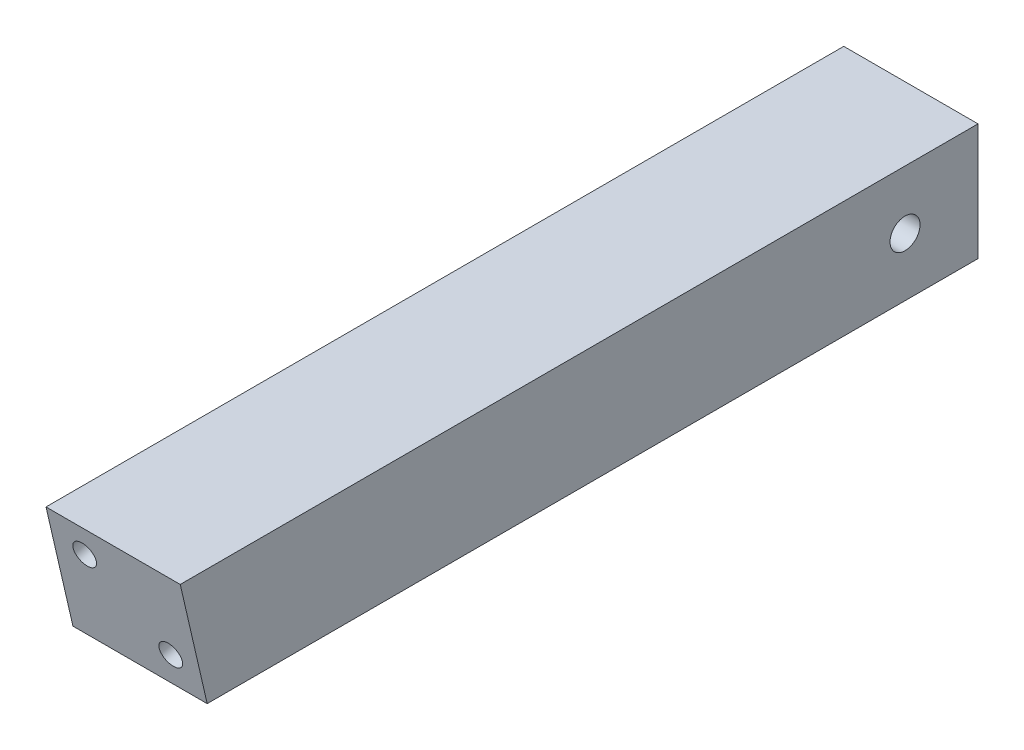
ISO-10303-21;
HEADER;
FILE_DESCRIPTION(('STEP AP214'),'2;1');
FILE_NAME('part.step','',(''),(''),'','','');
FILE_SCHEMA(('AUTOMOTIVE_DESIGN { 1 0 10303 214 1 1 1 1 }'));
ENDSEC;
DATA;
#1=APPLICATION_CONTEXT('core data for automotive mechanical design processes');
#2=APPLICATION_PROTOCOL_DEFINITION('international standard','automotive_design',2000,#1);
#3=PRODUCT_CONTEXT('',#1,'mechanical');
#4=PRODUCT('Part','Part','',(#3));
#5=PRODUCT_RELATED_PRODUCT_CATEGORY('part','',(#4));
#6=PRODUCT_DEFINITION_FORMATION('','',#4);
#7=PRODUCT_DEFINITION_CONTEXT('part definition',#1,'design');
#8=PRODUCT_DEFINITION('design','',#6,#7);
#9=PRODUCT_DEFINITION_SHAPE('','',#8);
#10=(LENGTH_UNIT() NAMED_UNIT(*) SI_UNIT(.MILLI.,.METRE.));
#11=(NAMED_UNIT(*) PLANE_ANGLE_UNIT() SI_UNIT($,.RADIAN.));
#12=(NAMED_UNIT(*) SI_UNIT($,.STERADIAN.) SOLID_ANGLE_UNIT());
#13=UNCERTAINTY_MEASURE_WITH_UNIT(LENGTH_MEASURE(1.E-05),#10,'distance_accuracy_value','');
#14=(GEOMETRIC_REPRESENTATION_CONTEXT(3) GLOBAL_UNCERTAINTY_ASSIGNED_CONTEXT((#13)) GLOBAL_UNIT_ASSIGNED_CONTEXT((#10,
#11,#12)) REPRESENTATION_CONTEXT('',''));
#15=CARTESIAN_POINT('',(0.,0.,0.));
#16=DIRECTION('',(0.,0.,1.));
#17=DIRECTION('',(1.,0.,0.));
#18=AXIS2_PLACEMENT_3D('',#15,#16,#17);
#19=CARTESIAN_POINT('',(267.669465585855,1012.34188712072,388.497872948252));
#20=DIRECTION('',(0.,-0.224951054343865,0.974370064785235));
#21=DIRECTION('',(0.,0.974370064785235,0.224951054343865));
#22=AXIS2_PLACEMENT_3D('',#19,#20,#21);
#23=PLANE('',#22);
#24=CARTESIAN_POINT('',(-7.62000000000001,6.51275008861376,156.283919500264));
#25=DIRECTION('',(0.,0.224951054343865,-0.974370064785235));
#26=DIRECTION('',(0.,0.974370064785235,0.224951054343865));
#27=AXIS2_PLACEMENT_3D('',#24,#25,#26);
#28=CIRCLE('',#27,2.52729999999989);
#29=CARTESIAN_POINT('',(-7.62000000000001,8.97527555334538,156.852438299907));
#30=VERTEX_POINT('',#29);
#31=EDGE_CURVE('E132',#30,#30,#28,.T.);
#32=ORIENTED_EDGE('',*,*,#31,.T.);
#33=EDGE_LOOP('',(#32));
#34=FACE_BOUND('',#33,.T.);
#35=CARTESIAN_POINT('',(8.25499999999999,-5.86174973415873,153.427041110097));
#36=DIRECTION('',(0.,0.224951054343865,-0.974370064785235));
#37=DIRECTION('',(0.,0.974370064785235,0.224951054343865));
#38=AXIS2_PLACEMENT_3D('',#35,#36,#37);
#39=CIRCLE('',#38,2.52729999999989);
#40=CARTESIAN_POINT('',(8.25499999999999,-3.39922426942711,153.99555990974));
#41=VERTEX_POINT('',#40);
#42=EDGE_CURVE('E135',#41,#41,#39,.T.);
#43=ORIENTED_EDGE('',*,*,#42,.T.);
#44=EDGE_LOOP('',(#43));
#45=FACE_BOUND('',#44,.T.);
#46=DIRECTION('',(0.,-0.974370064785235,-0.224951054343865));
#47=VECTOR('',#46,1.);
#48=CARTESIAN_POINT('',(-14.605,20.653377152135,159.5485404918));
#49=LINE('',#48,#47);
#50=CARTESIAN_POINT('',(-14.605,12.7,157.712358695347));
#51=VERTEX_POINT('',#50);
#52=CARTESIAN_POINT('',(-14.605,-12.7,151.848306640758));
#53=VERTEX_POINT('',#52);
#54=EDGE_CURVE('E46',#51,#53,#49,.T.);
#55=ORIENTED_EDGE('',*,*,#54,.T.);
#56=DIRECTION('',(1.,0.,0.));
#57=VECTOR('',#56,1.);
#58=CARTESIAN_POINT('',(14.605,-12.7,151.848306640758));
#59=LINE('',#58,#57);
#60=CARTESIAN_POINT('',(14.605,-12.7,151.848306640758));
#61=VERTEX_POINT('',#60);
#62=EDGE_CURVE('E97',#53,#61,#59,.T.);
#63=ORIENTED_EDGE('',*,*,#62,.T.);
#64=DIRECTION('',(0.,0.974370064785235,0.224951054343865));
#65=VECTOR('',#64,1.);
#66=CARTESIAN_POINT('',(14.605,20.653377152135,159.5485404918));
#67=LINE('',#66,#65);
#68=CARTESIAN_POINT('',(14.605,12.7,157.712358695347));
#69=VERTEX_POINT('',#68);
#70=EDGE_CURVE('E109',#61,#69,#67,.T.);
#71=ORIENTED_EDGE('',*,*,#70,.T.);
#72=DIRECTION('',(-1.,0.,0.));
#73=VECTOR('',#72,1.);
#74=CARTESIAN_POINT('',(14.605,12.7,157.712358695347));
#75=LINE('',#74,#73);
#76=EDGE_CURVE('E102',#69,#51,#75,.T.);
#77=ORIENTED_EDGE('',*,*,#76,.T.);
#78=EDGE_LOOP('',(#55,#63,#71,#77));
#79=FACE_BOUND('',#78,.T.);
#80=ADVANCED_FACE('F39',(#34,#45,#79),#23,.T.);
#81=CARTESIAN_POINT('',(14.605,-12.7,193.998401745355));
#82=DIRECTION('',(0.,-1.,0.));
#83=DIRECTION('',(1.,0.,0.));
#84=AXIS2_PLACEMENT_3D('',#81,#82,#83);
#85=PLANE('',#84);
#86=DIRECTION('',(0.,0.,-1.));
#87=VECTOR('',#86,1.);
#88=CARTESIAN_POINT('',(-14.605,-12.7,193.998401745355));
#89=LINE('',#88,#87);
#90=CARTESIAN_POINT('',(-14.605,-12.7,-15.875));
#91=VERTEX_POINT('',#90);
#92=EDGE_CURVE('E11',#53,#91,#89,.T.);
#93=ORIENTED_EDGE('',*,*,#92,.T.);
#94=DIRECTION('',(1.,0.,0.));
#95=VECTOR('',#94,1.);
#96=CARTESIAN_POINT('',(14.605,-12.7,-15.875));
#97=LINE('',#96,#95);
#98=CARTESIAN_POINT('',(14.605,-12.7,-15.875));
#99=VERTEX_POINT('',#98);
#100=EDGE_CURVE('E88',#91,#99,#97,.T.);
#101=ORIENTED_EDGE('',*,*,#100,.T.);
#102=DIRECTION('',(0.,0.,-1.));
#103=VECTOR('',#102,1.);
#104=CARTESIAN_POINT('',(14.605,-12.7,193.998401745355));
#105=LINE('',#104,#103);
#106=EDGE_CURVE('E59',#61,#99,#105,.T.);
#107=ORIENTED_EDGE('',*,*,#106,.F.);
#108=ORIENTED_EDGE('',*,*,#62,.F.);
#109=EDGE_LOOP('',(#93,#101,#107,#108));
#110=FACE_BOUND('',#109,.T.);
#111=ADVANCED_FACE('F95',(#110),#85,.T.);
#112=CARTESIAN_POINT('',(14.605,12.7,193.998401745355));
#113=DIRECTION('',(1.,0.,0.));
#114=DIRECTION('',(0.,1.,0.));
#115=AXIS2_PLACEMENT_3D('',#112,#113,#114);
#116=PLANE('',#115);
#117=CARTESIAN_POINT('',(14.605,0.,0.));
#118=DIRECTION('',(1.,0.,0.));
#119=DIRECTION('',(0.,-1.,0.));
#120=AXIS2_PLACEMENT_3D('',#117,#118,#119);
#121=CIRCLE('',#120,3.2639);
#122=CARTESIAN_POINT('',(14.605,-3.2639,0.));
#123=VERTEX_POINT('',#122);
#124=EDGE_CURVE('E141',#123,#123,#121,.T.);
#125=ORIENTED_EDGE('',*,*,#124,.F.);
#126=EDGE_LOOP('',(#125));
#127=FACE_BOUND('',#126,.T.);
#128=ORIENTED_EDGE('',*,*,#106,.T.);
#129=DIRECTION('',(0.,1.,0.));
#130=VECTOR('',#129,1.);
#131=CARTESIAN_POINT('',(14.605,12.7,-15.875));
#132=LINE('',#131,#130);
#133=CARTESIAN_POINT('',(14.605,12.7,-15.875));
#134=VERTEX_POINT('',#133);
#135=EDGE_CURVE('E93',#99,#134,#132,.T.);
#136=ORIENTED_EDGE('',*,*,#135,.T.);
#137=DIRECTION('',(0.,0.,-1.));
#138=VECTOR('',#137,1.);
#139=CARTESIAN_POINT('',(14.605,12.7,193.998401745355));
#140=LINE('',#139,#138);
#141=EDGE_CURVE('E108',#69,#134,#140,.T.);
#142=ORIENTED_EDGE('',*,*,#141,.F.);
#143=ORIENTED_EDGE('',*,*,#70,.F.);
#144=EDGE_LOOP('',(#128,#136,#142,#143));
#145=FACE_BOUND('',#144,.T.);
#146=ADVANCED_FACE('F112',(#127,#145),#116,.T.);
#147=CARTESIAN_POINT('',(14.605,12.7,193.998401745355));
#148=DIRECTION('',(0.,1.,0.));
#149=DIRECTION('',(-1.,0.,0.));
#150=AXIS2_PLACEMENT_3D('',#147,#148,#149);
#151=PLANE('',#150);
#152=ORIENTED_EDGE('',*,*,#141,.T.);
#153=DIRECTION('',(-1.,0.,0.));
#154=VECTOR('',#153,1.);
#155=CARTESIAN_POINT('',(14.605,12.7,-15.875));
#156=LINE('',#155,#154);
#157=CARTESIAN_POINT('',(-14.605,12.7,-15.875));
#158=VERTEX_POINT('',#157);
#159=EDGE_CURVE('E82',#134,#158,#156,.T.);
#160=ORIENTED_EDGE('',*,*,#159,.T.);
#161=DIRECTION('',(0.,0.,-1.));
#162=VECTOR('',#161,1.);
#163=CARTESIAN_POINT('',(-14.605,12.7,193.998401745355));
#164=LINE('',#163,#162);
#165=EDGE_CURVE('E72',#51,#158,#164,.T.);
#166=ORIENTED_EDGE('',*,*,#165,.F.);
#167=ORIENTED_EDGE('',*,*,#76,.F.);
#168=EDGE_LOOP('',(#152,#160,#166,#167));
#169=FACE_BOUND('',#168,.T.);
#170=ADVANCED_FACE('F113',(#169),#151,.T.);
#171=CARTESIAN_POINT('',(-14.605,12.7,193.998401745355));
#172=DIRECTION('',(-1.,0.,0.));
#173=DIRECTION('',(0.,-1.,0.));
#174=AXIS2_PLACEMENT_3D('',#171,#172,#173);
#175=PLANE('',#174);
#176=CARTESIAN_POINT('',(-14.605,0.,0.));
#177=DIRECTION('',(1.,0.,0.));
#178=DIRECTION('',(0.,-1.,0.));
#179=AXIS2_PLACEMENT_3D('',#176,#177,#178);
#180=CIRCLE('',#179,3.2639);
#181=CARTESIAN_POINT('',(-14.605,-3.2639,0.));
#182=VERTEX_POINT('',#181);
#183=EDGE_CURVE('E147',#182,#182,#180,.T.);
#184=ORIENTED_EDGE('',*,*,#183,.T.);
#185=EDGE_LOOP('',(#184));
#186=FACE_BOUND('',#185,.T.);
#187=ORIENTED_EDGE('',*,*,#165,.T.);
#188=DIRECTION('',(0.,-1.,0.));
#189=VECTOR('',#188,1.);
#190=CARTESIAN_POINT('',(-14.605,12.7,-15.875));
#191=LINE('',#190,#189);
#192=EDGE_CURVE('E79',#158,#91,#191,.T.);
#193=ORIENTED_EDGE('',*,*,#192,.T.);
#194=ORIENTED_EDGE('',*,*,#92,.F.);
#195=ORIENTED_EDGE('',*,*,#54,.F.);
#196=EDGE_LOOP('',(#187,#193,#194,#195));
#197=FACE_BOUND('',#196,.T.);
#198=ADVANCED_FACE('F87',(#186,#197),#175,.T.);
#199=CARTESIAN_POINT('',(0.,0.,-15.875));
#200=DIRECTION('',(0.,0.,1.));
#201=DIRECTION('',(-1.,0.,0.));
#202=AXIS2_PLACEMENT_3D('',#199,#200,#201);
#203=PLANE('',#202);
#204=ORIENTED_EDGE('',*,*,#192,.F.);
#205=ORIENTED_EDGE('',*,*,#159,.F.);
#206=ORIENTED_EDGE('',*,*,#135,.F.);
#207=ORIENTED_EDGE('',*,*,#100,.F.);
#208=EDGE_LOOP('',(#204,#205,#206,#207));
#209=FACE_BOUND('',#208,.T.);
#210=ADVANCED_FACE('F91',(#209),#203,.F.);
#211=CARTESIAN_POINT('',(8.25499999999999,-2.29065174644987,137.958916331631));
#212=DIRECTION('',(0.,-0.224951054343865,0.974370064785235));
#213=DIRECTION('',(0.,0.974370064785235,0.224951054343865));
#214=AXIS2_PLACEMENT_3D('',#211,#212,#213);
#215=CYLINDRICAL_SURFACE('',#214,2.52729999999989);
#216=CARTESIAN_POINT('',(8.25499999999999,-2.29065174644987,137.958916331631));
#217=DIRECTION('',(0.,0.224951054343865,-0.974370064785235));
#218=DIRECTION('',(0.,0.974370064785235,0.224951054343865));
#219=AXIS2_PLACEMENT_3D('',#216,#217,#218);
#220=CIRCLE('',#219,2.52729999999989);
#221=CARTESIAN_POINT('',(8.25499999999999,0.17187371828175,138.527435131274));
#222=VERTEX_POINT('',#221);
#223=EDGE_CURVE('E137',#222,#222,#220,.T.);
#224=ORIENTED_EDGE('',*,*,#223,.T.);
#225=EDGE_LOOP('',(#224));
#226=FACE_BOUND('',#225,.T.);
#227=ORIENTED_EDGE('',*,*,#42,.F.);
#228=EDGE_LOOP('',(#227));
#229=FACE_BOUND('',#228,.T.);
#230=ADVANCED_FACE('F170',(#226,#229),#215,.F.);
#231=CARTESIAN_POINT('',(8.25499999999999,-2.29065174644987,137.958916331631));
#232=DIRECTION('',(0.,-0.224951054343865,0.974370064785235));
#233=DIRECTION('',(0.,0.974370064785235,0.224951054343865));
#234=AXIS2_PLACEMENT_3D('',#231,#232,#233);
#235=PLANE('',#234);
#236=ORIENTED_EDGE('',*,*,#223,.F.);
#237=EDGE_LOOP('',(#236));
#238=FACE_BOUND('',#237,.T.);
#239=ADVANCED_FACE('F168',(#238),#235,.T.);
#240=CARTESIAN_POINT('',(-7.62000000000001,10.0838480763226,140.815794721798));
#241=DIRECTION('',(0.,-0.224951054343865,0.974370064785235));
#242=DIRECTION('',(0.,0.974370064785235,0.224951054343865));
#243=AXIS2_PLACEMENT_3D('',#240,#241,#242);
#244=CYLINDRICAL_SURFACE('',#243,2.52729999999989);
#245=CARTESIAN_POINT('',(-7.62000000000001,10.0838480763226,140.815794721798));
#246=DIRECTION('',(0.,0.224951054343865,-0.974370064785235));
#247=DIRECTION('',(0.,0.974370064785235,0.224951054343865));
#248=AXIS2_PLACEMENT_3D('',#245,#246,#247);
#249=CIRCLE('',#248,2.52729999999989);
#250=CARTESIAN_POINT('',(-7.62000000000001,12.5463735410542,141.384313521441));
#251=VERTEX_POINT('',#250);
#252=EDGE_CURVE('E89',#251,#251,#249,.T.);
#253=ORIENTED_EDGE('',*,*,#252,.T.);
#254=EDGE_LOOP('',(#253));
#255=FACE_BOUND('',#254,.T.);
#256=ORIENTED_EDGE('',*,*,#31,.F.);
#257=EDGE_LOOP('',(#256));
#258=FACE_BOUND('',#257,.T.);
#259=ADVANCED_FACE('F162',(#255,#258),#244,.F.);
#260=CARTESIAN_POINT('',(-7.62000000000001,10.0838480763226,140.815794721798));
#261=DIRECTION('',(0.,-0.224951054343865,0.974370064785235));
#262=DIRECTION('',(0.,0.974370064785235,0.224951054343865));
#263=AXIS2_PLACEMENT_3D('',#260,#261,#262);
#264=PLANE('',#263);
#265=ORIENTED_EDGE('',*,*,#252,.F.);
#266=EDGE_LOOP('',(#265));
#267=FACE_BOUND('',#266,.T.);
#268=ADVANCED_FACE('F156',(#267),#264,.T.);
#269=CARTESIAN_POINT('',(14.605,0.,0.));
#270=DIRECTION('',(-1.,0.,0.));
#271=DIRECTION('',(0.,-1.,0.));
#272=AXIS2_PLACEMENT_3D('',#269,#270,#271);
#273=CYLINDRICAL_SURFACE('',#272,3.2639);
#274=CARTESIAN_POINT('',(14.605,-3.2639,0.));
#275=CARTESIAN_POINT('',(14.3007291666667,-3.2639,0.));
#276=CARTESIAN_POINT('',(13.9964583333333,-3.2639,0.));
#277=CARTESIAN_POINT('',(13.3879166666667,-3.2639,0.));
#278=CARTESIAN_POINT('',(13.0836458333333,-3.2639,0.));
#279=CARTESIAN_POINT('',(12.4751041666667,-3.2639,0.));
#280=CARTESIAN_POINT('',(12.1708333333333,-3.2639,0.));
#281=CARTESIAN_POINT('',(11.5622916666667,-3.2639,0.));
#282=CARTESIAN_POINT('',(11.2580208333333,-3.2639,0.));
#283=CARTESIAN_POINT('',(10.6494791666667,-3.2639,0.));
#284=CARTESIAN_POINT('',(10.3452083333333,-3.2639,0.));
#285=CARTESIAN_POINT('',(9.73666666666667,-3.2639,0.));
#286=CARTESIAN_POINT('',(9.43239583333333,-3.2639,0.));
#287=CARTESIAN_POINT('',(8.82385416666667,-3.2639,0.));
#288=CARTESIAN_POINT('',(8.51958333333333,-3.2639,0.));
#289=CARTESIAN_POINT('',(7.91104166666667,-3.2639,0.));
#290=CARTESIAN_POINT('',(7.60677083333333,-3.2639,0.));
#291=CARTESIAN_POINT('',(6.99822916666667,-3.2639,0.));
#292=CARTESIAN_POINT('',(6.69395833333333,-3.2639,0.));
#293=CARTESIAN_POINT('',(6.08541666666667,-3.2639,0.));
#294=CARTESIAN_POINT('',(5.78114583333333,-3.2639,0.));
#295=CARTESIAN_POINT('',(5.17260416666667,-3.2639,0.));
#296=CARTESIAN_POINT('',(4.86833333333333,-3.2639,0.));
#297=CARTESIAN_POINT('',(4.25979166666667,-3.2639,0.));
#298=CARTESIAN_POINT('',(3.95552083333334,-3.2639,0.));
#299=CARTESIAN_POINT('',(3.34697916666667,-3.2639,0.));
#300=CARTESIAN_POINT('',(3.04270833333333,-3.2639,0.));
#301=CARTESIAN_POINT('',(2.43416666666667,-3.2639,0.));
#302=CARTESIAN_POINT('',(2.12989583333334,-3.2639,0.));
#303=CARTESIAN_POINT('',(1.52135416666667,-3.2639,0.));
#304=CARTESIAN_POINT('',(1.21708333333334,-3.2639,0.));
#305=CARTESIAN_POINT('',(0.608541666666669,-3.2639,0.));
#306=CARTESIAN_POINT('',(0.304270833333335,-3.2639,0.));
#307=CARTESIAN_POINT('',(-0.304270833333332,-3.2639,0.));
#308=CARTESIAN_POINT('',(-0.608541666666665,-3.2639,0.));
#309=CARTESIAN_POINT('',(-1.21708333333333,-3.2639,0.));
#310=CARTESIAN_POINT('',(-1.52135416666667,-3.2639,0.));
#311=CARTESIAN_POINT('',(-2.12989583333333,-3.2639,0.));
#312=CARTESIAN_POINT('',(-2.43416666666666,-3.2639,0.));
#313=CARTESIAN_POINT('',(-3.04270833333333,-3.2639,0.));
#314=CARTESIAN_POINT('',(-3.34697916666667,-3.2639,0.));
#315=CARTESIAN_POINT('',(-3.95552083333333,-3.2639,0.));
#316=CARTESIAN_POINT('',(-4.25979166666667,-3.2639,0.));
#317=CARTESIAN_POINT('',(-4.86833333333333,-3.2639,0.));
#318=CARTESIAN_POINT('',(-5.17260416666667,-3.2639,0.));
#319=CARTESIAN_POINT('',(-5.78114583333333,-3.2639,0.));
#320=CARTESIAN_POINT('',(-6.08541666666667,-3.2639,0.));
#321=CARTESIAN_POINT('',(-6.69395833333333,-3.2639,0.));
#322=CARTESIAN_POINT('',(-6.99822916666667,-3.2639,0.));
#323=CARTESIAN_POINT('',(-7.60677083333333,-3.2639,0.));
#324=CARTESIAN_POINT('',(-7.91104166666666,-3.2639,0.));
#325=CARTESIAN_POINT('',(-8.51958333333333,-3.2639,0.));
#326=CARTESIAN_POINT('',(-8.82385416666667,-3.2639,0.));
#327=CARTESIAN_POINT('',(-9.43239583333333,-3.2639,0.));
#328=CARTESIAN_POINT('',(-9.73666666666666,-3.2639,0.));
#329=CARTESIAN_POINT('',(-10.3452083333333,-3.2639,0.));
#330=CARTESIAN_POINT('',(-10.6494791666667,-3.2639,0.));
#331=CARTESIAN_POINT('',(-11.2580208333333,-3.2639,0.));
#332=CARTESIAN_POINT('',(-11.5622916666667,-3.2639,0.));
#333=CARTESIAN_POINT('',(-12.1708333333333,-3.2639,0.));
#334=CARTESIAN_POINT('',(-12.4751041666667,-3.2639,0.));
#335=CARTESIAN_POINT('',(-13.0836458333333,-3.2639,0.));
#336=CARTESIAN_POINT('',(-13.3879166666667,-3.2639,0.));
#337=CARTESIAN_POINT('',(-13.9964583333333,-3.2639,0.));
#338=CARTESIAN_POINT('',(-14.3007291666667,-3.2639,0.));
#339=CARTESIAN_POINT('',(-14.605,-3.2639,0.));
#340=B_SPLINE_CURVE_WITH_KNOTS('',3,(#274,#275,#276,#277,#278,#279,#280,#281,#282,#283,#284,
#285,#286,#287,#288,#289,#290,#291,#292,#293,#294,#295,#296,#297,#298,#299,#300,#301,#302,#303,
#304,#305,#306,#307,#308,#309,#310,#311,#312,#313,#314,#315,#316,#317,#318,#319,#320,#321,#322,
#323,#324,#325,#326,#327,#328,#329,#330,#331,#332,#333,#334,#335,#336,#337,#338,#339),
.UNSPECIFIED.,.F.,.F.,(4,2,2,2,2,2,2,2,2,2,2,2,2,2,2,2,2,2,2,2,2,2,2,2,2,2,2,2,2,2,2,2,4),(0.,
0.9128125,1.825625,2.7384375,3.65125,4.5640625,5.476875,6.3896875,7.3025,8.2153125,9.128125,
10.0409375,10.95375,11.8665625,12.779375,13.6921875,14.605,15.5178125,16.430625,17.3434375,
18.25625,19.1690625,20.081875,20.9946875,21.9075,22.8203125,23.733125,24.6459375,25.55875,
26.4715625,27.384375,28.2971875,29.21),.UNSPECIFIED.);
#341=EDGE_CURVE('BSEAM153',#123,#182,#340,.T.);
#342=ORIENTED_EDGE('',*,*,#124,.T.);
#343=ORIENTED_EDGE('',*,*,#183,.F.);
#344=ORIENTED_EDGE('',*,*,#341,.T.);
#345=ORIENTED_EDGE('',*,*,#341,.F.);
#346=EDGE_LOOP('',(#342,#344,#343,#345));
#347=FACE_BOUND('',#346,.T.);
#348=ADVANCED_FACE('F153',(#347),#273,.F.);
#349=CLOSED_SHELL('',(#80,#111,#146,#170,#198,#210,#230,#239,#259,#268,#348));
#350=MANIFOLD_SOLID_BREP('B2',#349);
#351=ADVANCED_BREP_SHAPE_REPRESENTATION('',(#18,#350),#14);
#352=SHAPE_DEFINITION_REPRESENTATION(#9,#351);
ENDSEC;
END-ISO-10303-21;
